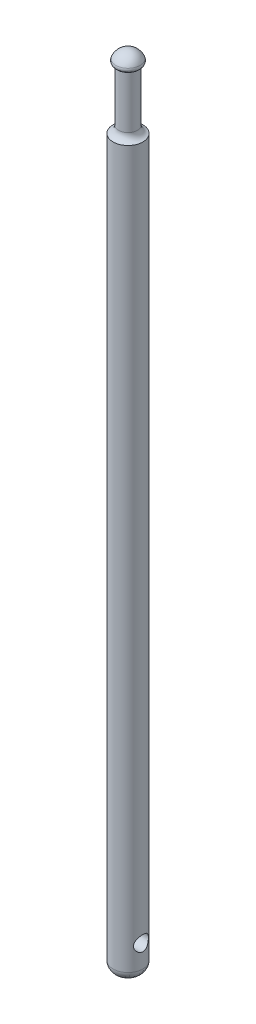
ISO-10303-21;
HEADER;
FILE_DESCRIPTION(('STEP AP214'),'2;1');
FILE_NAME('part.step','',(''),(''),'','','');
FILE_SCHEMA(('AUTOMOTIVE_DESIGN { 1 0 10303 214 1 1 1 1 }'));
ENDSEC;
DATA;
#1=APPLICATION_CONTEXT('core data for automotive mechanical design processes');
#2=APPLICATION_PROTOCOL_DEFINITION('international standard','automotive_design',2000,#1);
#3=PRODUCT_CONTEXT('',#1,'mechanical');
#4=PRODUCT('Part','Part','',(#3));
#5=PRODUCT_RELATED_PRODUCT_CATEGORY('part','',(#4));
#6=PRODUCT_DEFINITION_FORMATION('','',#4);
#7=PRODUCT_DEFINITION_CONTEXT('part definition',#1,'design');
#8=PRODUCT_DEFINITION('design','',#6,#7);
#9=PRODUCT_DEFINITION_SHAPE('','',#8);
#10=(LENGTH_UNIT() NAMED_UNIT(*) SI_UNIT(.MILLI.,.METRE.));
#11=(NAMED_UNIT(*) PLANE_ANGLE_UNIT() SI_UNIT($,.RADIAN.));
#12=(NAMED_UNIT(*) SI_UNIT($,.STERADIAN.) SOLID_ANGLE_UNIT());
#13=UNCERTAINTY_MEASURE_WITH_UNIT(LENGTH_MEASURE(1.E-05),#10,'distance_accuracy_value','');
#14=(GEOMETRIC_REPRESENTATION_CONTEXT(3) GLOBAL_UNCERTAINTY_ASSIGNED_CONTEXT((#13)) GLOBAL_UNIT_ASSIGNED_CONTEXT((#10,
#11,#12)) REPRESENTATION_CONTEXT('',''));
#15=CARTESIAN_POINT('',(0.,0.,0.));
#16=DIRECTION('',(0.,0.,1.));
#17=DIRECTION('',(1.,0.,0.));
#18=AXIS2_PLACEMENT_3D('',#15,#16,#17);
#19=CARTESIAN_POINT('',(0.,104.,0.));
#20=DIRECTION('',(0.,-1.,0.));
#21=DIRECTION('',(0.,0.,-1.));
#22=AXIS2_PLACEMENT_3D('',#19,#20,#21);
#23=CYLINDRICAL_SURFACE('',#22,2.);
#24=CARTESIAN_POINT('',(0.,0.,0.));
#25=DIRECTION('',(0.,1.,0.));
#26=DIRECTION('',(0.,0.,1.));
#27=AXIS2_PLACEMENT_3D('',#24,#25,#26);
#28=CIRCLE('',#27,2.);
#29=CARTESIAN_POINT('',(0.,0.,2.));
#30=VERTEX_POINT('',#29);
#31=EDGE_CURVE('E59',#30,#30,#28,.T.);
#32=ORIENTED_EDGE('',*,*,#31,.T.);
#33=EDGE_LOOP('',(#32));
#34=FACE_BOUND('',#33,.T.);
#35=CARTESIAN_POINT('',(1.73205080756888,3.,-1.));
#36=CARTESIAN_POINT('',(1.73205534728459,2.94789219180475,-0.999996363074532));
#37=CARTESIAN_POINT('',(1.73443801187756,2.89571858847496,-0.995899970733217));
#38=CARTESIAN_POINT('',(1.74362366452052,2.79297273532285,-0.979723209898054));
#39=CARTESIAN_POINT('',(1.75043594055559,2.74240408495659,-0.967626064554179));
#40=CARTESIAN_POINT('',(1.76749346605398,2.64454833565606,-0.936099948699813));
#41=CARTESIAN_POINT('',(1.77772043473252,2.59724534752642,-0.916709952493732));
#42=CARTESIAN_POINT('',(1.80042664816858,2.50657579800328,-0.871267525376373));
#43=CARTESIAN_POINT('',(1.81290601476064,2.46320944973755,-0.845214734035775));
#44=CARTESIAN_POINT('',(1.83996869057441,2.3776942714425,-0.784666540530881));
#45=CARTESIAN_POINT('',(1.85464063637953,2.33594086432646,-0.749652036143774));
#46=CARTESIAN_POINT('',(1.88371982785706,2.25859161159329,-0.673253807614473));
#47=CARTESIAN_POINT('',(1.8981269383125,2.22299883741648,-0.631866925782298));
#48=CARTESIAN_POINT('',(1.92621476952949,2.15663284885234,-0.540489563414553));
#49=CARTESIAN_POINT('',(1.93978106418172,2.12634623214047,-0.490107189012582));
#50=CARTESIAN_POINT('',(1.96350756099529,2.07485914675424,-0.384157026599512));
#51=CARTESIAN_POINT('',(1.97366991183741,2.05365294386283,-0.328592538138164));
#52=CARTESIAN_POINT('',(1.98880461244237,2.02249533869891,-0.218044943925986));
#53=CARTESIAN_POINT('',(1.99409480220892,2.01185047364447,-0.163301790488826));
#54=CARTESIAN_POINT('',(2.00007583846067,1.99983388132496,-0.0525706286978564));
#55=CARTESIAN_POINT('',(2.0007694678459,1.99845654320429,0.00341660584373042));
#56=CARTESIAN_POINT('',(1.9976298191645,2.00474667397035,0.109832524423742));
#57=CARTESIAN_POINT('',(1.9941849589216,2.01163801552122,0.160321199176784));
#58=CARTESIAN_POINT('',(1.98374245259748,2.03288084390466,0.259313771918316));
#59=CARTESIAN_POINT('',(1.97674454066394,2.04723288897622,0.30781752109392));
#60=CARTESIAN_POINT('',(1.95971583287654,2.08308256608981,0.402309391569549));
#61=CARTESIAN_POINT('',(1.94964441529199,2.10467631317206,0.448253423515174));
#62=CARTESIAN_POINT('',(1.92737645986687,2.15426341620149,0.535976801513324));
#63=CARTESIAN_POINT('',(1.91517916157484,2.18225906330235,0.577754648838642));
#64=CARTESIAN_POINT('',(1.88844394399229,2.24689535153301,0.660173660898192));
#65=CARTESIAN_POINT('',(1.87379375998175,2.28410302832601,0.700334075029357));
#66=CARTESIAN_POINT('',(1.84454340586812,2.36458972493017,0.774104370297777));
#67=CARTESIAN_POINT('',(1.82994328265629,2.40787337227406,0.807709211574228));
#68=CARTESIAN_POINT('',(1.80144156092485,2.50264819242408,0.869505334642209));
#69=CARTESIAN_POINT('',(1.78764319990708,2.55448602305421,0.897217314978049));
#70=CARTESIAN_POINT('',(1.76375450278576,2.66293767135899,0.94331911300123));
#71=CARTESIAN_POINT('',(1.75366030046067,2.71954643301756,0.961718658210888));
#72=CARTESIAN_POINT('',(1.73944635817034,2.83121451128278,0.987180211025039));
#73=CARTESIAN_POINT('',(1.73491655848496,2.88604111904354,0.995025122119975));
#74=CARTESIAN_POINT('',(1.7311791936161,2.99640134151653,1.00151694661143));
#75=CARTESIAN_POINT('',(1.73196786889312,3.05193442911978,1.00017035731503));
#76=CARTESIAN_POINT('',(1.73834336540585,3.15565391857872,0.989036043343968));
#77=CARTESIAN_POINT('',(1.74339587506654,3.20397945110792,0.980187816712469));
#78=CARTESIAN_POINT('',(1.75694021551341,3.29836778627095,0.955696284632444));
#79=CARTESIAN_POINT('',(1.76543316005034,3.3444298507466,0.940050778623617));
#80=CARTESIAN_POINT('',(1.78536222079656,3.43541133090269,0.90164758860489));
#81=CARTESIAN_POINT('',(1.79691643243063,3.48017901685354,0.878594063692728));
#82=CARTESIAN_POINT('',(1.82156119497249,3.56546927153899,0.826287064015809));
#83=CARTESIAN_POINT('',(1.83465253355147,3.60598964351328,0.797030404332221));
#84=CARTESIAN_POINT('',(1.86287998456336,3.68697876752354,0.728837167198859));
#85=CARTESIAN_POINT('',(1.87806583154289,3.72679715071765,0.689145272314972));
#86=CARTESIAN_POINT('',(1.90734234977892,3.79941223799359,0.603404495398294));
#87=CARTESIAN_POINT('',(1.92143265007709,3.83220657023054,0.557353474655352));
#88=CARTESIAN_POINT('',(1.94741361690957,3.8905737259501,0.458535362558762));
#89=CARTESIAN_POINT('',(1.95923641672029,3.91593311821091,0.405623097574118));
#90=CARTESIAN_POINT('',(1.97883354959301,3.95713790385739,0.295522364641087));
#91=CARTESIAN_POINT('',(1.98661143676373,3.9729916513663,0.23833770139218));
#92=CARTESIAN_POINT('',(1.99667508181883,3.99336856417466,0.126979682330421));
#93=CARTESIAN_POINT('',(1.99939927908191,3.99879787587611,0.0730114438504612));
#94=CARTESIAN_POINT('',(2.00042130375131,4.0008432654544,-0.0351259859511993));
#95=CARTESIAN_POINT('',(1.9987206806689,3.99746242852356,-0.0892951002950823));
#96=CARTESIAN_POINT('',(1.99133968837923,3.98258359320438,-0.192537992317142));
#97=CARTESIAN_POINT('',(1.9859289466799,3.97163515074233,-0.241712317811259));
#98=CARTESIAN_POINT('',(1.97192093663423,3.94267300069703,-0.337445952183613));
#99=CARTESIAN_POINT('',(1.96332321132796,3.92465827990655,-0.384004884955504));
#100=CARTESIAN_POINT('',(1.9432593074812,3.88127294783403,-0.475423406244879));
#101=CARTESIAN_POINT('',(1.93168617198799,3.85562067679217,-0.520125142700041));
#102=CARTESIAN_POINT('',(1.90688133141826,3.79804206914095,-0.604774641814019));
#103=CARTESIAN_POINT('',(1.89364886558361,3.76611285088433,-0.644720207414901));
#104=CARTESIAN_POINT('',(1.86528610226628,3.6932028609773,-0.722914004156886));
#105=CARTESIAN_POINT('',(1.85009799011698,3.65163751252281,-0.760597684539267));
#106=CARTESIAN_POINT('',(1.82063076162852,3.56254927887024,-0.828663287394671));
#107=CARTESIAN_POINT('',(1.80635245761866,3.51502117913232,-0.859038750010054));
#108=CARTESIAN_POINT('',(1.77999605304916,3.41336335341905,-0.912431079785651));
#109=CARTESIAN_POINT('',(1.7680017425627,3.35907246887127,-0.935185065960937));
#110=CARTESIAN_POINT('',(1.74866156328352,3.24666759566023,-0.97087870950641));
#111=CARTESIAN_POINT('',(1.74130016147702,3.18856711108732,-0.983851191175346));
#112=CARTESIAN_POINT('',(1.73529272601791,3.10819464434801,-0.994367007864414));
#113=CARTESIAN_POINT('',(1.73408129005152,3.08663210560212,-0.99647610496385));
#114=CARTESIAN_POINT('',(1.7324593588775,3.04338351931776,-0.999293405089963));
#115=CARTESIAN_POINT('',(1.73204891725109,3.02169746361413,-1.00000151439987));
#116=CARTESIAN_POINT('',(1.73205080756888,3.,-1.));
#117=B_SPLINE_CURVE_WITH_KNOTS('',3,(#35,#36,#37,#38,#39,#40,#41,#42,#43,#44,#45,#46,#47,#48,
#49,#50,#51,#52,#53,#54,#55,#56,#57,#58,#59,#60,#61,#62,#63,#64,#65,#66,#67,#68,#69,#70,#71,#72,
#73,#74,#75,#76,#77,#78,#79,#80,#81,#82,#83,#84,#85,#86,#87,#88,#89,#90,#91,#92,#93,#94,#95,#96,
#97,#98,#99,#100,#101,#102,#103,#104,#105,#106,#107,#108,#109,#110,#111,#112,#113,#114,#115,
#116),.UNSPECIFIED.,.T.,.F.,(4,2,2,2,2,2,2,2,2,2,2,2,2,2,2,2,2,2,2,2,2,2,2,2,2,2,2,2,2,2,2,2,2,
2,2,2,2,2,2,2,4),(0.,0.156232122594715,0.312792892824803,0.468528595918883,0.624272725445146,
0.792862312498228,0.961535710843702,1.14157892238763,1.3215082696389,1.48863484967934,
1.65566023686039,1.80816097484538,1.96067312517455,2.11529534731146,2.26997299350271,
2.4392719145689,2.60870048245918,2.78888841729448,2.96888774211704,3.13462290854211,
3.30024093188372,3.44774183424025,3.59529052436062,3.74967296406087,3.90413486220047,
4.07806743580613,4.25205864978202,4.43064181412965,4.60906779808771,4.77112270389486,
4.93312086793971,5.08444424871492,5.23578933512012,5.39360750719471,5.55149830100718,
5.72510241850067,5.89885942845153,6.07810749038604,6.2567513300276,6.32180135185309,
6.38685572494541),.UNSPECIFIED.);
#118=CARTESIAN_POINT('',(1.73205080756888,3.,-1.));
#119=VERTEX_POINT('',#118);
#120=EDGE_CURVE('E58',#119,#119,#117,.T.);
#121=ORIENTED_EDGE('',*,*,#120,.T.);
#122=EDGE_LOOP('',(#121));
#123=FACE_BOUND('',#122,.T.);
#124=CARTESIAN_POINT('',(-2.,2.,0.));
#125=CARTESIAN_POINT('',(-1.99999713404151,2.0000033023195,-0.0525719629529867));
#126=CARTESIAN_POINT('',(-1.99790491019518,2.00417007312168,-0.105206599698033));
#127=CARTESIAN_POINT('',(-1.98974156037396,2.02065288034092,-0.208920235268426));
#128=CARTESIAN_POINT('',(-1.98366287828984,2.03298439299765,-0.259996086713504));
#129=CARTESIAN_POINT('',(-1.96816279403312,2.0651938086168,-0.358933544880576));
#130=CARTESIAN_POINT('',(-1.9587543917752,2.08504238424801,-0.406806802939181));
#131=CARTESIAN_POINT('',(-1.93745776515778,2.13157062136494,-0.498472616806567));
#132=CARTESIAN_POINT('',(-1.9255697363353,2.15824974424885,-0.542265493990052));
#133=CARTESIAN_POINT('',(-1.89956258258057,2.2195172494853,-0.627507817761921));
#134=CARTESIAN_POINT('',(-1.88535199127536,2.25448647923964,-0.668655211122114));
#135=CARTESIAN_POINT('',(-1.85659970246744,2.33052147924704,-0.744779444866979));
#136=CARTESIAN_POINT('',(-1.84205776209035,2.37159185177244,-0.779751583106768));
#137=CARTESIAN_POINT('',(-1.81298951197347,2.46248334952338,-0.84525200045028));
#138=CARTESIAN_POINT('',(-1.79855186970132,2.51273609834591,-0.875225335551638));
#139=CARTESIAN_POINT('',(-1.77285978772321,2.61836733598622,-0.926168226890696));
#140=CARTESIAN_POINT('',(-1.7616030760699,2.67374212872275,-0.947144214966334));
#141=CARTESIAN_POINT('',(-1.74457867037809,2.78466510542192,-0.978132442188589));
#142=CARTESIAN_POINT('',(-1.73852271583714,2.84000445206739,-0.988725857080441));
#143=CARTESIAN_POINT('',(-1.73181889948528,2.95197883777948,-1.00042699330885));
#144=CARTESIAN_POINT('',(-1.73116569343288,3.00861254087115,-1.00154408837307));
#145=CARTESIAN_POINT('',(-1.73510930257248,3.11428602431537,-0.994687287172295));
#146=CARTESIAN_POINT('',(-1.73908763662014,3.16342403122305,-0.987784559536822));
#147=CARTESIAN_POINT('',(-1.7507622873385,3.25972190937304,-0.966939849056933));
#148=CARTESIAN_POINT('',(-1.75845978831776,3.30688114530531,-0.952995623897653));
#149=CARTESIAN_POINT('',(-1.77687476412741,3.39922913256566,-0.918209780386005));
#150=CARTESIAN_POINT('',(-1.78765840663998,3.44434639878579,-0.897215067115996));
#151=CARTESIAN_POINT('',(-1.81103404281404,3.53063429259001,-0.849041687668003));
#152=CARTESIAN_POINT('',(-1.82362684780191,3.57180313560009,-0.821860243812468));
#153=CARTESIAN_POINT('',(-1.85113157903286,3.65452125274323,-0.758066054912789));
#154=CARTESIAN_POINT('',(-1.86613510236746,3.69545687357616,-0.720694458369282));
#155=CARTESIAN_POINT('',(-1.89547623300407,3.7707354185909,-0.639555578741373));
#156=CARTESIAN_POINT('',(-1.90981351958801,3.80507519203388,-0.595785256574284));
#157=CARTESIAN_POINT('',(-1.93701987282964,3.86768566102973,-0.500516505831847));
#158=CARTESIAN_POINT('',(-1.94978984162007,3.89560047244574,-0.448753591599407));
#159=CARTESIAN_POINT('',(-1.97157881121242,3.94209702904301,-0.340466215488795));
#160=CARTESIAN_POINT('',(-1.98060078943553,3.96068618501517,-0.283945576265274));
#161=CARTESIAN_POINT('',(-1.99324333741436,3.98647540371668,-0.172766491660699));
#162=CARTESIAN_POINT('',(-1.99724938301312,3.99449123574678,-0.118341530548322));
#163=CARTESIAN_POINT('',(-2.00073013459102,4.00146473113449,-0.00877959994935163));
#164=CARTESIAN_POINT('',(-2.00020698721312,4.00042668563948,0.0463570198699033));
#165=CARTESIAN_POINT('',(-1.99491192253441,3.98979331158125,0.151232971985995));
#166=CARTESIAN_POINT('',(-1.9904724568819,3.98086746726997,0.201059408049955));
#167=CARTESIAN_POINT('',(-1.97822171314819,3.95576192810491,0.298406892301917));
#168=CARTESIAN_POINT('',(-1.97041006334332,3.93958143354664,0.345927685690997));
#169=CARTESIAN_POINT('',(-1.9518425141367,3.90000153356683,0.438888608449665));
#170=CARTESIAN_POINT('',(-1.94100881769939,3.87640894988319,0.484230397006153));
#171=CARTESIAN_POINT('',(-1.91743974317109,3.82289246435396,0.57046136169892));
#172=CARTESIAN_POINT('',(-1.90470355565785,3.79296586540657,0.611348629775281));
#173=CARTESIAN_POINT('',(-1.87708221337464,3.72423957466713,0.691767689290652));
#174=CARTESIAN_POINT('',(-1.86210884848441,3.68485713154644,0.730772077824638));
#175=CARTESIAN_POINT('',(-1.83262391603874,3.6000748487307,0.801856321113239));
#176=CARTESIAN_POINT('',(-1.81811267381526,3.55467088118363,0.83393138569084));
#177=CARTESIAN_POINT('',(-1.79051192226068,3.45635634579969,0.891707914497695));
#178=CARTESIAN_POINT('',(-1.77752529663472,3.40318873379141,0.917025495878637));
#179=CARTESIAN_POINT('',(-1.75574072368126,3.29248993230748,0.958082826013803));
#180=CARTESIAN_POINT('',(-1.74693738240618,3.23496447349881,0.97383491588757));
#181=CARTESIAN_POINT('',(-1.73561501008667,3.12308977713855,0.993861687449679));
#182=CARTESIAN_POINT('',(-1.73257383460491,3.06896574657096,0.999092996400865));
#183=CARTESIAN_POINT('',(-1.73165354646175,2.96055293282927,1.00068915438079));
#184=CARTESIAN_POINT('',(-1.73377219627553,2.90626423126056,0.997057846624398));
#185=CARTESIAN_POINT('',(-1.74237862050025,2.80451649846798,0.981926125592262));
#186=CARTESIAN_POINT('',(-1.74843094482394,2.7568995298556,0.971208314342799));
#187=CARTESIAN_POINT('',(-1.76371016187918,2.66419188057529,0.943175358224644));
#188=CARTESIAN_POINT('',(-1.77293807569676,2.61910201790803,0.925858091159809));
#189=CARTESIAN_POINT('',(-1.79428530364528,2.52937514901339,0.883815745300681));
#190=CARTESIAN_POINT('',(-1.80655722396191,2.4849720981703,0.858671137816456));
#191=CARTESIAN_POINT('',(-1.8323533163459,2.40072546381941,0.802150971636633));
#192=CARTESIAN_POINT('',(-1.84587813794522,2.36088426948151,0.770772171238647));
#193=CARTESIAN_POINT('',(-1.87462323159313,2.28185801764238,0.69820332666464));
#194=CARTESIAN_POINT('',(-1.88984983311469,2.24334089763808,0.65628442301017));
#195=CARTESIAN_POINT('',(-1.91877752255088,2.17373701657637,0.566154806220279));
#196=CARTESIAN_POINT('',(-1.9324777860804,2.14265426057371,0.517940723256785));
#197=CARTESIAN_POINT('',(-1.95698009585103,2.0887636372378,0.415931596819948));
#198=CARTESIAN_POINT('',(-1.96776096562909,2.06601583058857,0.362099503934615));
#199=CARTESIAN_POINT('',(-1.98501341363465,2.03019183208105,0.250742101294193));
#200=CARTESIAN_POINT('',(-1.99149723372932,2.01708815317042,0.193227799623167));
#201=CARTESIAN_POINT('',(-1.99695461909663,2.00610258892415,0.112601946483385));
#202=CARTESIAN_POINT('',(-1.99809365339202,2.00381735913638,0.0901618794394998));
#203=CARTESIAN_POINT('',(-1.99961696977865,2.00076533448319,0.0451517318071582));
#204=CARTESIAN_POINT('',(-2.00000123103763,1.9999985815288,0.0225816476473817));
#205=CARTESIAN_POINT('',(-2.,2.,0.));
#206=B_SPLINE_CURVE_WITH_KNOTS('',3,(#124,#125,#126,#127,#128,#129,#130,#131,#132,#133,#134,
#135,#136,#137,#138,#139,#140,#141,#142,#143,#144,#145,#146,#147,#148,#149,#150,#151,#152,#153,
#154,#155,#156,#157,#158,#159,#160,#161,#162,#163,#164,#165,#166,#167,#168,#169,#170,#171,#172,
#173,#174,#175,#176,#177,#178,#179,#180,#181,#182,#183,#184,#185,#186,#187,#188,#189,#190,#191,
#192,#193,#194,#195,#196,#197,#198,#199,#200,#201,#202,#203,#204,#205),.UNSPECIFIED.,.T.,.F.,(4,
2,2,2,2,2,2,2,2,2,2,2,2,2,2,2,2,2,2,2,2,2,2,2,2,2,2,2,2,2,2,2,2,2,2,2,2,2,2,2,4),(0.,
0.157624257420293,0.315548149709199,0.4728621554923,0.63016376058157,0.796981758718091,
0.963926237654038,1.14381726430753,1.32357947898281,1.49258012140229,1.6614135732902,
1.8100571240932,1.95874803925678,2.11090240168487,2.26312521260222,2.43464941333878,
2.60625534598686,2.78583022214441,2.9652621691228,3.12983290471346,3.29432564511476,
3.44606906506122,3.59782921630931,3.75392856027899,3.91009450748339,4.08159610644419,
4.25321588615432,4.43314682159674,4.61284511940778,4.77529307498374,4.93767059860006,
5.08457930244183,5.23153528783678,5.38836456775614,5.54527561138958,5.72125242752498,
5.89732383376572,6.07464013662925,6.2514490862493,6.31915280137697,6.38685838514847),.UNSPECIFIED.);
#207=CARTESIAN_POINT('',(-2.,2.,0.));
#208=VERTEX_POINT('',#207);
#209=EDGE_CURVE('E63',#208,#208,#206,.T.);
#210=ORIENTED_EDGE('',*,*,#209,.T.);
#211=EDGE_LOOP('',(#210));
#212=FACE_BOUND('',#211,.T.);
#213=CARTESIAN_POINT('',(0.,96.,0.));
#214=DIRECTION('',(0.,1.,0.));
#215=DIRECTION('',(-1.,0.,0.));
#216=AXIS2_PLACEMENT_3D('',#213,#214,#215);
#217=CIRCLE('',#216,2.);
#218=CARTESIAN_POINT('',(-2.,96.,0.));
#219=VERTEX_POINT('',#218);
#220=EDGE_CURVE('E61',#219,#219,#217,.T.);
#221=ORIENTED_EDGE('',*,*,#220,.F.);
#222=EDGE_LOOP('',(#221));
#223=FACE_BOUND('',#222,.T.);
#224=ADVANCED_FACE('F41',(#34,#123,#212,#223),#23,.T.);
#225=CARTESIAN_POINT('',(0.,0.,0.));
#226=DIRECTION('',(-1.,0.,0.));
#227=DIRECTION('',(0.,0.,1.));
#228=AXIS2_PLACEMENT_3D('',#225,#226,#227);
#229=ELLIPSE('',#228,2.,1.5);
#230=TRIMMED_CURVE('',#229,(PARAMETER_VALUE(4.71238898038469)),
(PARAMETER_VALUE(7.85398163397448)),.T.,.PARAMETER.);
#231=CARTESIAN_POINT('',(0.,1.5,0.));
#232=DIRECTION('',(0.,-1.,0.));
#233=AXIS1_PLACEMENT('',#231,#232);
#234=SURFACE_OF_REVOLUTION('',#230,#233);
#235=CARTESIAN_POINT('',(0.,-1.5,0.));
#236=VERTEX_POINT('',#235);
#237=VERTEX_LOOP('',#236);
#238=FACE_BOUND('',#237,.T.);
#239=ORIENTED_EDGE('',*,*,#31,.F.);
#240=EDGE_LOOP('',(#239));
#241=FACE_BOUND('',#240,.T.);
#242=ADVANCED_FACE('F51',(#238,#241),#234,.F.);
#243=CARTESIAN_POINT('',(-2.,3.,0.));
#244=DIRECTION('',(1.,0.,0.));
#245=DIRECTION('',(0.,0.,-1.));
#246=AXIS2_PLACEMENT_3D('',#243,#244,#245);
#247=CYLINDRICAL_SURFACE('',#246,1.);
#248=ORIENTED_EDGE('',*,*,#120,.F.);
#249=EDGE_LOOP('',(#248));
#250=FACE_BOUND('',#249,.T.);
#251=ORIENTED_EDGE('',*,*,#209,.F.);
#252=EDGE_LOOP('',(#251));
#253=FACE_BOUND('',#252,.T.);
#254=ADVANCED_FACE('F53',(#250,#253),#247,.F.);
#255=CARTESIAN_POINT('',(0.,105.75,0.));
#256=DIRECTION('',(0.,1.,0.));
#257=DIRECTION('',(-1.,0.,0.));
#258=AXIS2_PLACEMENT_3D('',#255,#256,#257);
#259=CYLINDRICAL_SURFACE('',#258,1.25);
#260=CARTESIAN_POINT('',(0.,96.9682458365518,0.));
#261=DIRECTION('',(0.,-1.,0.));
#262=DIRECTION('',(1.,0.,0.));
#263=AXIS2_PLACEMENT_3D('',#260,#261,#262);
#264=CIRCLE('',#263,1.25);
#265=CARTESIAN_POINT('',(1.25,96.9682458365518,0.));
#266=VERTEX_POINT('',#265);
#267=EDGE_CURVE('E11',#266,#266,#264,.F.);
#268=ORIENTED_EDGE('',*,*,#267,.T.);
#269=EDGE_LOOP('',(#268));
#270=FACE_BOUND('',#269,.T.);
#271=CARTESIAN_POINT('',(0.,104.,0.));
#272=DIRECTION('',(0.,1.,0.));
#273=DIRECTION('',(-1.,0.,0.));
#274=AXIS2_PLACEMENT_3D('',#271,#272,#273);
#275=CIRCLE('',#274,1.25);
#276=CARTESIAN_POINT('',(-1.25,104.,0.));
#277=VERTEX_POINT('',#276);
#278=EDGE_CURVE('E70',#277,#277,#275,.T.);
#279=ORIENTED_EDGE('',*,*,#278,.F.);
#280=EDGE_LOOP('',(#279));
#281=FACE_BOUND('',#280,.T.);
#282=ADVANCED_FACE('F87',(#270,#281),#259,.T.);
#283=CARTESIAN_POINT('',(0.,104.,0.));
#284=DIRECTION('',(0.,-1.,0.));
#285=DIRECTION('',(-1.,0.,0.));
#286=AXIS2_PLACEMENT_3D('',#283,#284,#285);
#287=SPHERICAL_SURFACE('',#286,1.75);
#288=CARTESIAN_POINT('',(0.,104.685857127979,0.));
#289=DIRECTION('',(0.,-1.,0.));
#290=DIRECTION('',(1.,0.,0.));
#291=AXIS2_PLACEMENT_3D('',#288,#289,#290);
#292=CIRCLE('',#291,1.61);
#293=CARTESIAN_POINT('',(1.61,104.685857127979,0.));
#294=VERTEX_POINT('',#293);
#295=EDGE_CURVE('E48',#294,#294,#292,.F.);
#296=ORIENTED_EDGE('',*,*,#295,.T.);
#297=EDGE_LOOP('',(#296));
#298=FACE_BOUND('',#297,.T.);
#299=ADVANCED_FACE('F81',(#298),#287,.T.);
#300=CARTESIAN_POINT('',(0.,104.489897948557,0.));
#301=DIRECTION('',(0.,1.,0.));
#302=DIRECTION('',(-1.,0.,0.));
#303=AXIS2_PLACEMENT_3D('',#300,#301,#302);
#304=TOROIDAL_SURFACE('',#303,1.15,0.5);
#305=ORIENTED_EDGE('',*,*,#278,.T.);
#306=EDGE_LOOP('',(#305));
#307=FACE_BOUND('',#306,.T.);
#308=ORIENTED_EDGE('',*,*,#295,.F.);
#309=EDGE_LOOP('',(#308));
#310=FACE_BOUND('',#309,.T.);
#311=ADVANCED_FACE('F79',(#307,#310),#304,.T.);
#312=CARTESIAN_POINT('',(0.,96.9682458365518,0.));
#313=DIRECTION('',(0.,-1.,0.));
#314=DIRECTION('',(1.,0.,0.));
#315=AXIS2_PLACEMENT_3D('',#312,#313,#314);
#316=TOROIDAL_SURFACE('',#315,2.25,1.);
#317=ORIENTED_EDGE('',*,*,#220,.T.);
#318=EDGE_LOOP('',(#317));
#319=FACE_BOUND('',#318,.T.);
#320=ORIENTED_EDGE('',*,*,#267,.F.);
#321=EDGE_LOOP('',(#320));
#322=FACE_BOUND('',#321,.T.);
#323=ADVANCED_FACE('F43',(#319,#322),#316,.F.);
#324=CLOSED_SHELL('',(#224,#242,#254,#282,#299,#311,#323));
#325=MANIFOLD_SOLID_BREP('B2',#324);
#326=ADVANCED_BREP_SHAPE_REPRESENTATION('',(#18,#325),#14);
#327=SHAPE_DEFINITION_REPRESENTATION(#9,#326);
ENDSEC;
END-ISO-10303-21;
